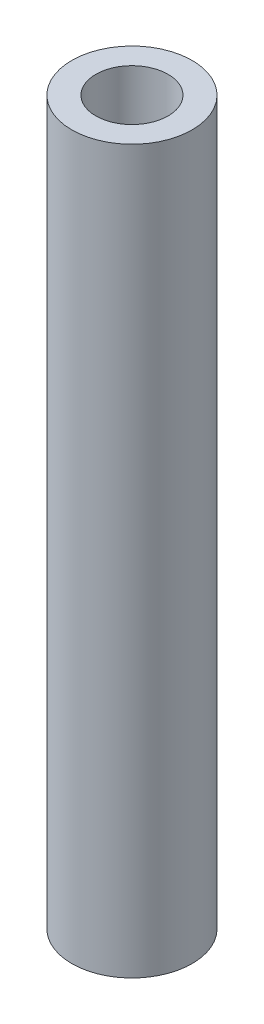
ISO-10303-21;
HEADER;
FILE_DESCRIPTION(('STEP AP214'),'2;1');
FILE_NAME('part.step','',(''),(''),'','','');
FILE_SCHEMA(('AUTOMOTIVE_DESIGN { 1 0 10303 214 1 1 1 1 }'));
ENDSEC;
DATA;
#1=APPLICATION_CONTEXT('core data for automotive mechanical design processes');
#2=APPLICATION_PROTOCOL_DEFINITION('international standard','automotive_design',2000,#1);
#3=PRODUCT_CONTEXT('',#1,'mechanical');
#4=PRODUCT('Part','Part','',(#3));
#5=PRODUCT_RELATED_PRODUCT_CATEGORY('part','',(#4));
#6=PRODUCT_DEFINITION_FORMATION('','',#4);
#7=PRODUCT_DEFINITION_CONTEXT('part definition',#1,'design');
#8=PRODUCT_DEFINITION('design','',#6,#7);
#9=PRODUCT_DEFINITION_SHAPE('','',#8);
#10=(LENGTH_UNIT() NAMED_UNIT(*) SI_UNIT(.MILLI.,.METRE.));
#11=(NAMED_UNIT(*) PLANE_ANGLE_UNIT() SI_UNIT($,.RADIAN.));
#12=(NAMED_UNIT(*) SI_UNIT($,.STERADIAN.) SOLID_ANGLE_UNIT());
#13=UNCERTAINTY_MEASURE_WITH_UNIT(LENGTH_MEASURE(1.E-05),#10,'distance_accuracy_value','');
#14=(GEOMETRIC_REPRESENTATION_CONTEXT(3) GLOBAL_UNCERTAINTY_ASSIGNED_CONTEXT((#13)) GLOBAL_UNIT_ASSIGNED_CONTEXT((#10,
#11,#12)) REPRESENTATION_CONTEXT('',''));
#15=CARTESIAN_POINT('',(0.,0.,0.));
#16=DIRECTION('',(0.,0.,1.));
#17=DIRECTION('',(1.,0.,0.));
#18=AXIS2_PLACEMENT_3D('',#15,#16,#17);
#19=CARTESIAN_POINT('',(0.,15.,0.));
#20=DIRECTION('',(0.,1.,0.));
#21=DIRECTION('',(0.,0.,1.));
#22=AXIS2_PLACEMENT_3D('',#19,#20,#21);
#23=PLANE('',#22);
#24=CARTESIAN_POINT('',(0.,15.,0.));
#25=DIRECTION('',(0.,1.,0.));
#26=DIRECTION('',(0.,0.,1.));
#27=AXIS2_PLACEMENT_3D('',#24,#25,#26);
#28=CIRCLE('',#27,2.5);
#29=CARTESIAN_POINT('',(0.,15.,2.5));
#30=VERTEX_POINT('',#29);
#31=EDGE_CURVE('E10',#30,#30,#28,.T.);
#32=ORIENTED_EDGE('',*,*,#31,.T.);
#33=EDGE_LOOP('',(#32));
#34=FACE_BOUND('',#33,.T.);
#35=CARTESIAN_POINT('',(0.,15.,0.));
#36=DIRECTION('',(0.,1.,0.));
#37=DIRECTION('',(0.,0.,1.));
#38=AXIS2_PLACEMENT_3D('',#35,#36,#37);
#39=CIRCLE('',#38,1.5);
#40=CARTESIAN_POINT('',(0.,15.,1.5));
#41=VERTEX_POINT('',#40);
#42=EDGE_CURVE('E42',#41,#41,#39,.T.);
#43=ORIENTED_EDGE('',*,*,#42,.F.);
#44=EDGE_LOOP('',(#43));
#45=FACE_BOUND('',#44,.T.);
#46=ADVANCED_FACE('F31',(#34,#45),#23,.T.);
#47=CARTESIAN_POINT('',(0.,-15.,0.));
#48=DIRECTION('',(0.,1.,0.));
#49=DIRECTION('',(0.,0.,1.));
#50=AXIS2_PLACEMENT_3D('',#47,#48,#49);
#51=PLANE('',#50);
#52=CARTESIAN_POINT('',(0.,-15.,0.));
#53=DIRECTION('',(0.,1.,0.));
#54=DIRECTION('',(0.,0.,1.));
#55=AXIS2_PLACEMENT_3D('',#52,#53,#54);
#56=CIRCLE('',#55,2.5);
#57=CARTESIAN_POINT('',(0.,-15.,2.5));
#58=VERTEX_POINT('',#57);
#59=EDGE_CURVE('E35',#58,#58,#56,.T.);
#60=ORIENTED_EDGE('',*,*,#59,.F.);
#61=EDGE_LOOP('',(#60));
#62=FACE_BOUND('',#61,.T.);
#63=CARTESIAN_POINT('',(0.,-15.,0.));
#64=DIRECTION('',(0.,1.,0.));
#65=DIRECTION('',(0.,0.,1.));
#66=AXIS2_PLACEMENT_3D('',#63,#64,#65);
#67=CIRCLE('',#66,1.5);
#68=CARTESIAN_POINT('',(0.,-15.,1.5));
#69=VERTEX_POINT('',#68);
#70=EDGE_CURVE('E44',#69,#69,#67,.T.);
#71=ORIENTED_EDGE('',*,*,#70,.T.);
#72=EDGE_LOOP('',(#71));
#73=FACE_BOUND('',#72,.T.);
#74=ADVANCED_FACE('F54',(#62,#73),#51,.F.);
#75=CARTESIAN_POINT('',(0.,15.,0.));
#76=DIRECTION('',(0.,-1.,0.));
#77=DIRECTION('',(0.,0.,-1.));
#78=AXIS2_PLACEMENT_3D('',#75,#76,#77);
#79=CYLINDRICAL_SURFACE('',#78,2.5);
#80=ORIENTED_EDGE('',*,*,#31,.F.);
#81=EDGE_LOOP('',(#80));
#82=FACE_BOUND('',#81,.T.);
#83=ORIENTED_EDGE('',*,*,#59,.T.);
#84=EDGE_LOOP('',(#83));
#85=FACE_BOUND('',#84,.T.);
#86=ADVANCED_FACE('F33',(#82,#85),#79,.T.);
#87=CARTESIAN_POINT('',(0.,15.,0.));
#88=DIRECTION('',(0.,-1.,0.));
#89=DIRECTION('',(0.,0.,-1.));
#90=AXIS2_PLACEMENT_3D('',#87,#88,#89);
#91=CYLINDRICAL_SURFACE('',#90,1.5);
#92=ORIENTED_EDGE('',*,*,#42,.T.);
#93=EDGE_LOOP('',(#92));
#94=FACE_BOUND('',#93,.T.);
#95=ORIENTED_EDGE('',*,*,#70,.F.);
#96=EDGE_LOOP('',(#95));
#97=FACE_BOUND('',#96,.T.);
#98=ADVANCED_FACE('F50',(#94,#97),#91,.F.);
#99=CLOSED_SHELL('',(#46,#74,#86,#98));
#100=MANIFOLD_SOLID_BREP('B2',#99);
#101=ADVANCED_BREP_SHAPE_REPRESENTATION('',(#18,#100),#14);
#102=SHAPE_DEFINITION_REPRESENTATION(#9,#101);
ENDSEC;
END-ISO-10303-21;
